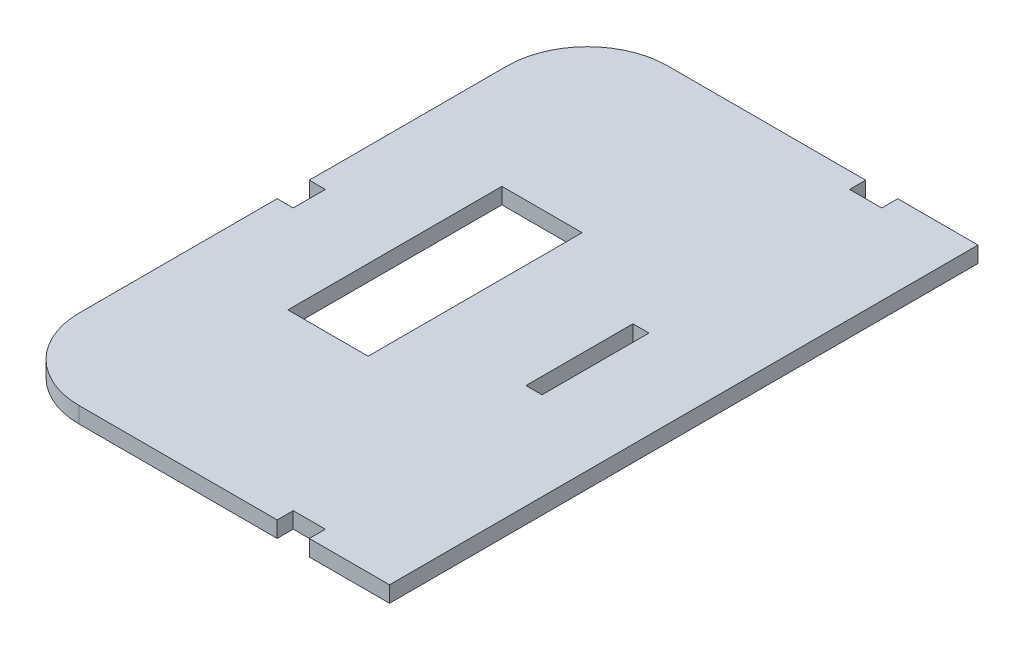
ISO-10303-21;
HEADER;
FILE_DESCRIPTION(('STEP AP214'),'2;1');
FILE_NAME('part.step','',(''),(''),'','','');
FILE_SCHEMA(('AUTOMOTIVE_DESIGN { 1 0 10303 214 1 1 1 1 }'));
ENDSEC;
DATA;
#1=APPLICATION_CONTEXT('core data for automotive mechanical design processes');
#2=APPLICATION_PROTOCOL_DEFINITION('international standard','automotive_design',2000,#1);
#3=PRODUCT_CONTEXT('',#1,'mechanical');
#4=PRODUCT('Part','Part','',(#3));
#5=PRODUCT_RELATED_PRODUCT_CATEGORY('part','',(#4));
#6=PRODUCT_DEFINITION_FORMATION('','',#4);
#7=PRODUCT_DEFINITION_CONTEXT('part definition',#1,'design');
#8=PRODUCT_DEFINITION('design','',#6,#7);
#9=PRODUCT_DEFINITION_SHAPE('','',#8);
#10=(LENGTH_UNIT() NAMED_UNIT(*) SI_UNIT(.MILLI.,.METRE.));
#11=(NAMED_UNIT(*) PLANE_ANGLE_UNIT() SI_UNIT($,.RADIAN.));
#12=(NAMED_UNIT(*) SI_UNIT($,.STERADIAN.) SOLID_ANGLE_UNIT());
#13=UNCERTAINTY_MEASURE_WITH_UNIT(LENGTH_MEASURE(1.E-05),#10,'distance_accuracy_value','');
#14=(GEOMETRIC_REPRESENTATION_CONTEXT(3) GLOBAL_UNCERTAINTY_ASSIGNED_CONTEXT((#13)) GLOBAL_UNIT_ASSIGNED_CONTEXT((#10,
#11,#12)) REPRESENTATION_CONTEXT('',''));
#15=CARTESIAN_POINT('',(0.,0.,0.));
#16=DIRECTION('',(0.,0.,1.));
#17=DIRECTION('',(1.,0.,0.));
#18=AXIS2_PLACEMENT_3D('',#15,#16,#17);
#19=CARTESIAN_POINT('',(73.,3.,0.));
#20=DIRECTION('',(1.,0.,0.));
#21=DIRECTION('',(0.,0.,-1.));
#22=AXIS2_PLACEMENT_3D('',#19,#20,#21);
#23=PLANE('',#22);
#24=DIRECTION('',(0.,0.,1.));
#25=VECTOR('',#24,1.);
#26=CARTESIAN_POINT('',(73.,0.,0.));
#27=LINE('',#26,#25);
#28=CARTESIAN_POINT('',(73.,0.,-110.));
#29=VERTEX_POINT('',#28);
#30=CARTESIAN_POINT('',(73.,0.,0.));
#31=VERTEX_POINT('',#30);
#32=EDGE_CURVE('E247',#29,#31,#27,.T.);
#33=ORIENTED_EDGE('',*,*,#32,.F.);
#34=DIRECTION('',(0.,-1.,0.));
#35=VECTOR('',#34,1.);
#36=CARTESIAN_POINT('',(73.,3.,-110.));
#37=LINE('',#36,#35);
#38=CARTESIAN_POINT('',(73.,3.,-110.));
#39=VERTEX_POINT('',#38);
#40=EDGE_CURVE('E383',#39,#29,#37,.T.);
#41=ORIENTED_EDGE('',*,*,#40,.F.);
#42=DIRECTION('',(0.,0.,1.));
#43=VECTOR('',#42,1.);
#44=CARTESIAN_POINT('',(73.,3.,0.));
#45=LINE('',#44,#43);
#46=CARTESIAN_POINT('',(73.,3.,0.));
#47=VERTEX_POINT('',#46);
#48=EDGE_CURVE('E270',#39,#47,#45,.T.);
#49=ORIENTED_EDGE('',*,*,#48,.T.);
#50=DIRECTION('',(0.,-1.,0.));
#51=VECTOR('',#50,1.);
#52=CARTESIAN_POINT('',(73.,3.,0.));
#53=LINE('',#52,#51);
#54=EDGE_CURVE('E311',#47,#31,#53,.T.);
#55=ORIENTED_EDGE('',*,*,#54,.T.);
#56=EDGE_LOOP('',(#33,#41,#49,#55));
#57=FACE_BOUND('',#56,.T.);
#58=ADVANCED_FACE('F41',(#57),#23,.T.);
#59=CARTESIAN_POINT('',(0.,3.,-110.));
#60=DIRECTION('',(0.,0.,-1.));
#61=DIRECTION('',(-1.,0.,0.));
#62=AXIS2_PLACEMENT_3D('',#59,#60,#61);
#63=PLANE('',#62);
#64=DIRECTION('',(1.,0.,0.));
#65=VECTOR('',#64,1.);
#66=CARTESIAN_POINT('',(0.,0.,-110.));
#67=LINE('',#66,#65);
#68=CARTESIAN_POINT('',(58.,0.,-110.));
#69=VERTEX_POINT('',#68);
#70=EDGE_CURVE('E314',#69,#29,#67,.T.);
#71=ORIENTED_EDGE('',*,*,#70,.F.);
#72=DIRECTION('',(0.,-1.,0.));
#73=VECTOR('',#72,1.);
#74=CARTESIAN_POINT('',(58.,3.,-110.));
#75=LINE('',#74,#73);
#76=CARTESIAN_POINT('',(58.,3.,-110.));
#77=VERTEX_POINT('',#76);
#78=EDGE_CURVE('E381',#77,#69,#75,.T.);
#79=ORIENTED_EDGE('',*,*,#78,.F.);
#80=DIRECTION('',(1.,0.,0.));
#81=VECTOR('',#80,1.);
#82=CARTESIAN_POINT('',(0.,3.,-110.));
#83=LINE('',#82,#81);
#84=EDGE_CURVE('E273',#77,#39,#83,.T.);
#85=ORIENTED_EDGE('',*,*,#84,.T.);
#86=ORIENTED_EDGE('',*,*,#40,.T.);
#87=EDGE_LOOP('',(#71,#79,#85,#86));
#88=FACE_BOUND('',#87,.T.);
#89=ADVANCED_FACE('F477',(#88),#63,.T.);
#90=CARTESIAN_POINT('',(57.9999999999995,3.,2.68303897617744E-13));
#91=DIRECTION('',(-1.,0.,0.));
#92=DIRECTION('',(0.,0.,1.));
#93=AXIS2_PLACEMENT_3D('',#90,#91,#92);
#94=PLANE('',#93);
#95=DIRECTION('',(0.,0.,-1.));
#96=VECTOR('',#95,1.);
#97=CARTESIAN_POINT('',(57.9999999999995,0.,2.68303897617744E-13));
#98=LINE('',#97,#96);
#99=CARTESIAN_POINT('',(58.,0.,-107.));
#100=VERTEX_POINT('',#99);
#101=EDGE_CURVE('E317',#100,#69,#98,.T.);
#102=ORIENTED_EDGE('',*,*,#101,.F.);
#103=DIRECTION('',(0.,-1.,0.));
#104=VECTOR('',#103,1.);
#105=CARTESIAN_POINT('',(58.,3.,-107.));
#106=LINE('',#105,#104);
#107=CARTESIAN_POINT('',(58.,3.,-107.));
#108=VERTEX_POINT('',#107);
#109=EDGE_CURVE('E379',#108,#100,#106,.T.);
#110=ORIENTED_EDGE('',*,*,#109,.F.);
#111=DIRECTION('',(0.,0.,-1.));
#112=VECTOR('',#111,1.);
#113=CARTESIAN_POINT('',(57.9999999999995,3.,2.68303897617744E-13));
#114=LINE('',#113,#112);
#115=EDGE_CURVE('E277',#108,#77,#114,.T.);
#116=ORIENTED_EDGE('',*,*,#115,.T.);
#117=ORIENTED_EDGE('',*,*,#78,.T.);
#118=EDGE_LOOP('',(#102,#110,#116,#117));
#119=FACE_BOUND('',#118,.T.);
#120=ADVANCED_FACE('F481',(#119),#94,.T.);
#121=CARTESIAN_POINT('',(0.,3.,-107.));
#122=DIRECTION('',(0.,0.,1.));
#123=DIRECTION('',(1.,0.,0.));
#124=AXIS2_PLACEMENT_3D('',#121,#122,#123);
#125=PLANE('',#124);
#126=DIRECTION('',(-1.,0.,0.));
#127=VECTOR('',#126,1.);
#128=CARTESIAN_POINT('',(0.,0.,-107.));
#129=LINE('',#128,#127);
#130=CARTESIAN_POINT('',(52.,0.,-107.));
#131=VERTEX_POINT('',#130);
#132=EDGE_CURVE('E320',#100,#131,#129,.T.);
#133=ORIENTED_EDGE('',*,*,#132,.T.);
#134=DIRECTION('',(0.,-1.,0.));
#135=VECTOR('',#134,1.);
#136=CARTESIAN_POINT('',(52.,3.,-107.));
#137=LINE('',#136,#135);
#138=CARTESIAN_POINT('',(52.,3.,-107.));
#139=VERTEX_POINT('',#138);
#140=EDGE_CURVE('E376',#139,#131,#137,.T.);
#141=ORIENTED_EDGE('',*,*,#140,.F.);
#142=DIRECTION('',(-1.,0.,0.));
#143=VECTOR('',#142,1.);
#144=CARTESIAN_POINT('',(0.,3.,-107.));
#145=LINE('',#144,#143);
#146=EDGE_CURVE('E280',#108,#139,#145,.T.);
#147=ORIENTED_EDGE('',*,*,#146,.F.);
#148=ORIENTED_EDGE('',*,*,#109,.T.);
#149=EDGE_LOOP('',(#133,#141,#147,#148));
#150=FACE_BOUND('',#149,.T.);
#151=ADVANCED_FACE('F486',(#150),#125,.F.);
#152=CARTESIAN_POINT('',(51.9999999999995,3.,2.40548322002115E-13));
#153=DIRECTION('',(-1.,0.,0.));
#154=DIRECTION('',(0.,0.,1.));
#155=AXIS2_PLACEMENT_3D('',#152,#153,#154);
#156=PLANE('',#155);
#157=DIRECTION('',(0.,0.,-1.));
#158=VECTOR('',#157,1.);
#159=CARTESIAN_POINT('',(51.9999999999995,0.,2.40548322002115E-13));
#160=LINE('',#159,#158);
#161=CARTESIAN_POINT('',(52.,0.,-110.));
#162=VERTEX_POINT('',#161);
#163=EDGE_CURVE('E322',#131,#162,#160,.T.);
#164=ORIENTED_EDGE('',*,*,#163,.T.);
#165=DIRECTION('',(0.,-1.,0.));
#166=VECTOR('',#165,1.);
#167=CARTESIAN_POINT('',(52.,3.,-110.));
#168=LINE('',#167,#166);
#169=CARTESIAN_POINT('',(52.,3.,-110.));
#170=VERTEX_POINT('',#169);
#171=EDGE_CURVE('E373',#170,#162,#168,.T.);
#172=ORIENTED_EDGE('',*,*,#171,.F.);
#173=DIRECTION('',(0.,0.,-1.));
#174=VECTOR('',#173,1.);
#175=CARTESIAN_POINT('',(51.9999999999995,3.,2.40548322002115E-13));
#176=LINE('',#175,#174);
#177=EDGE_CURVE('E282',#139,#170,#176,.T.);
#178=ORIENTED_EDGE('',*,*,#177,.F.);
#179=ORIENTED_EDGE('',*,*,#140,.T.);
#180=EDGE_LOOP('',(#164,#172,#178,#179));
#181=FACE_BOUND('',#180,.T.);
#182=ADVANCED_FACE('F490',(#181),#156,.F.);
#183=CARTESIAN_POINT('',(0.,3.,-110.));
#184=DIRECTION('',(0.,0.,-1.));
#185=DIRECTION('',(-1.,0.,0.));
#186=AXIS2_PLACEMENT_3D('',#183,#184,#185);
#187=PLANE('',#186);
#188=DIRECTION('',(1.,0.,0.));
#189=VECTOR('',#188,1.);
#190=CARTESIAN_POINT('',(0.,0.,-110.));
#191=LINE('',#190,#189);
#192=CARTESIAN_POINT('',(15.,0.,-110.));
#193=VERTEX_POINT('',#192);
#194=EDGE_CURVE('E325',#193,#162,#191,.T.);
#195=ORIENTED_EDGE('',*,*,#194,.F.);
#196=DIRECTION('',(0.,-1.,0.));
#197=VECTOR('',#196,1.);
#198=CARTESIAN_POINT('',(15.,3.,-110.));
#199=LINE('',#198,#197);
#200=CARTESIAN_POINT('',(15.,3.,-110.));
#201=VERTEX_POINT('',#200);
#202=EDGE_CURVE('E11',#193,#201,#199,.F.);
#203=ORIENTED_EDGE('',*,*,#202,.T.);
#204=DIRECTION('',(1.,0.,0.));
#205=VECTOR('',#204,1.);
#206=CARTESIAN_POINT('',(0.,3.,-110.));
#207=LINE('',#206,#205);
#208=EDGE_CURVE('E285',#201,#170,#207,.T.);
#209=ORIENTED_EDGE('',*,*,#208,.T.);
#210=ORIENTED_EDGE('',*,*,#171,.T.);
#211=EDGE_LOOP('',(#195,#203,#209,#210));
#212=FACE_BOUND('',#211,.T.);
#213=ADVANCED_FACE('F492',(#212),#187,.T.);
#214=CARTESIAN_POINT('',(0.,3.,0.));
#215=DIRECTION('',(-1.,0.,0.));
#216=DIRECTION('',(0.,0.,1.));
#217=AXIS2_PLACEMENT_3D('',#214,#215,#216);
#218=PLANE('',#217);
#219=DIRECTION('',(0.,0.,-1.));
#220=VECTOR('',#219,1.);
#221=CARTESIAN_POINT('',(0.,3.,0.));
#222=LINE('',#221,#220);
#223=CARTESIAN_POINT('',(0.,3.,-58.));
#224=VERTEX_POINT('',#223);
#225=CARTESIAN_POINT('',(0.,3.,-95.));
#226=VERTEX_POINT('',#225);
#227=EDGE_CURVE('E287',#224,#226,#222,.T.);
#228=ORIENTED_EDGE('',*,*,#227,.T.);
#229=DIRECTION('',(0.,-1.,0.));
#230=VECTOR('',#229,1.);
#231=CARTESIAN_POINT('',(0.,3.,-95.));
#232=LINE('',#231,#230);
#233=CARTESIAN_POINT('',(0.,0.,-95.));
#234=VERTEX_POINT('',#233);
#235=EDGE_CURVE('E49',#226,#234,#232,.T.);
#236=ORIENTED_EDGE('',*,*,#235,.T.);
#237=DIRECTION('',(0.,0.,-1.));
#238=VECTOR('',#237,1.);
#239=CARTESIAN_POINT('',(0.,0.,0.));
#240=LINE('',#239,#238);
#241=CARTESIAN_POINT('',(0.,0.,-58.));
#242=VERTEX_POINT('',#241);
#243=EDGE_CURVE('E327',#242,#234,#240,.T.);
#244=ORIENTED_EDGE('',*,*,#243,.F.);
#245=DIRECTION('',(0.,-1.,0.));
#246=VECTOR('',#245,1.);
#247=CARTESIAN_POINT('',(0.,3.,-58.));
#248=LINE('',#247,#246);
#249=EDGE_CURVE('E371',#224,#242,#248,.T.);
#250=ORIENTED_EDGE('',*,*,#249,.F.);
#251=EDGE_LOOP('',(#228,#236,#244,#250));
#252=FACE_BOUND('',#251,.T.);
#253=ADVANCED_FACE('F421',(#252),#218,.T.);
#254=CARTESIAN_POINT('',(0.,3.,-58.));
#255=DIRECTION('',(0.,0.,1.));
#256=DIRECTION('',(1.,0.,0.));
#257=AXIS2_PLACEMENT_3D('',#254,#255,#256);
#258=PLANE('',#257);
#259=DIRECTION('',(-1.,0.,0.));
#260=VECTOR('',#259,1.);
#261=CARTESIAN_POINT('',(0.,0.,-58.));
#262=LINE('',#261,#260);
#263=CARTESIAN_POINT('',(3.,0.,-58.));
#264=VERTEX_POINT('',#263);
#265=EDGE_CURVE('E330',#264,#242,#262,.T.);
#266=ORIENTED_EDGE('',*,*,#265,.F.);
#267=DIRECTION('',(0.,-1.,0.));
#268=VECTOR('',#267,1.);
#269=CARTESIAN_POINT('',(3.,3.,-58.));
#270=LINE('',#269,#268);
#271=CARTESIAN_POINT('',(3.,3.,-58.));
#272=VERTEX_POINT('',#271);
#273=EDGE_CURVE('E369',#272,#264,#270,.T.);
#274=ORIENTED_EDGE('',*,*,#273,.F.);
#275=DIRECTION('',(-1.,0.,0.));
#276=VECTOR('',#275,1.);
#277=CARTESIAN_POINT('',(0.,3.,-58.));
#278=LINE('',#277,#276);
#279=EDGE_CURVE('E289',#272,#224,#278,.T.);
#280=ORIENTED_EDGE('',*,*,#279,.T.);
#281=ORIENTED_EDGE('',*,*,#249,.T.);
#282=EDGE_LOOP('',(#266,#274,#280,#281));
#283=FACE_BOUND('',#282,.T.);
#284=ADVANCED_FACE('F430',(#283),#258,.T.);
#285=CARTESIAN_POINT('',(3.,3.,0.));
#286=DIRECTION('',(1.,0.,0.));
#287=DIRECTION('',(0.,0.,-1.));
#288=AXIS2_PLACEMENT_3D('',#285,#286,#287);
#289=PLANE('',#288);
#290=DIRECTION('',(0.,0.,1.));
#291=VECTOR('',#290,1.);
#292=CARTESIAN_POINT('',(3.,0.,0.));
#293=LINE('',#292,#291);
#294=CARTESIAN_POINT('',(3.,0.,-52.));
#295=VERTEX_POINT('',#294);
#296=EDGE_CURVE('E333',#264,#295,#293,.T.);
#297=ORIENTED_EDGE('',*,*,#296,.T.);
#298=DIRECTION('',(0.,-1.,0.));
#299=VECTOR('',#298,1.);
#300=CARTESIAN_POINT('',(3.,3.,-52.));
#301=LINE('',#300,#299);
#302=CARTESIAN_POINT('',(3.,3.,-52.));
#303=VERTEX_POINT('',#302);
#304=EDGE_CURVE('E366',#303,#295,#301,.T.);
#305=ORIENTED_EDGE('',*,*,#304,.F.);
#306=DIRECTION('',(0.,0.,1.));
#307=VECTOR('',#306,1.);
#308=CARTESIAN_POINT('',(3.,3.,0.));
#309=LINE('',#308,#307);
#310=EDGE_CURVE('E292',#272,#303,#309,.T.);
#311=ORIENTED_EDGE('',*,*,#310,.F.);
#312=ORIENTED_EDGE('',*,*,#273,.T.);
#313=EDGE_LOOP('',(#297,#305,#311,#312));
#314=FACE_BOUND('',#313,.T.);
#315=ADVANCED_FACE('F438',(#314),#289,.F.);
#316=CARTESIAN_POINT('',(0.,3.,-52.));
#317=DIRECTION('',(0.,0.,1.));
#318=DIRECTION('',(1.,0.,0.));
#319=AXIS2_PLACEMENT_3D('',#316,#317,#318);
#320=PLANE('',#319);
#321=DIRECTION('',(-1.,0.,0.));
#322=VECTOR('',#321,1.);
#323=CARTESIAN_POINT('',(0.,0.,-52.));
#324=LINE('',#323,#322);
#325=CARTESIAN_POINT('',(0.,0.,-52.));
#326=VERTEX_POINT('',#325);
#327=EDGE_CURVE('E335',#295,#326,#324,.T.);
#328=ORIENTED_EDGE('',*,*,#327,.T.);
#329=DIRECTION('',(0.,-1.,0.));
#330=VECTOR('',#329,1.);
#331=CARTESIAN_POINT('',(0.,3.,-52.));
#332=LINE('',#331,#330);
#333=CARTESIAN_POINT('',(0.,3.,-52.));
#334=VERTEX_POINT('',#333);
#335=EDGE_CURVE('E363',#334,#326,#332,.T.);
#336=ORIENTED_EDGE('',*,*,#335,.F.);
#337=DIRECTION('',(-1.,0.,0.));
#338=VECTOR('',#337,1.);
#339=CARTESIAN_POINT('',(0.,3.,-52.));
#340=LINE('',#339,#338);
#341=EDGE_CURVE('E294',#303,#334,#340,.T.);
#342=ORIENTED_EDGE('',*,*,#341,.F.);
#343=ORIENTED_EDGE('',*,*,#304,.T.);
#344=EDGE_LOOP('',(#328,#336,#342,#343));
#345=FACE_BOUND('',#344,.T.);
#346=ADVANCED_FACE('F440',(#345),#320,.F.);
#347=CARTESIAN_POINT('',(0.,3.,0.));
#348=DIRECTION('',(-1.,0.,0.));
#349=DIRECTION('',(0.,0.,1.));
#350=AXIS2_PLACEMENT_3D('',#347,#348,#349);
#351=PLANE('',#350);
#352=DIRECTION('',(0.,0.,-1.));
#353=VECTOR('',#352,1.);
#354=CARTESIAN_POINT('',(0.,0.,0.));
#355=LINE('',#354,#353);
#356=CARTESIAN_POINT('',(0.,0.,-15.));
#357=VERTEX_POINT('',#356);
#358=EDGE_CURVE('E338',#357,#326,#355,.T.);
#359=ORIENTED_EDGE('',*,*,#358,.F.);
#360=DIRECTION('',(0.,-1.,0.));
#361=VECTOR('',#360,1.);
#362=CARTESIAN_POINT('',(0.,3.,-15.));
#363=LINE('',#362,#361);
#364=CARTESIAN_POINT('',(0.,3.,-15.));
#365=VERTEX_POINT('',#364);
#366=EDGE_CURVE('E413',#357,#365,#363,.F.);
#367=ORIENTED_EDGE('',*,*,#366,.T.);
#368=DIRECTION('',(0.,0.,-1.));
#369=VECTOR('',#368,1.);
#370=CARTESIAN_POINT('',(0.,3.,0.));
#371=LINE('',#370,#369);
#372=EDGE_CURVE('E297',#365,#334,#371,.T.);
#373=ORIENTED_EDGE('',*,*,#372,.T.);
#374=ORIENTED_EDGE('',*,*,#335,.T.);
#375=EDGE_LOOP('',(#359,#367,#373,#374));
#376=FACE_BOUND('',#375,.T.);
#377=ADVANCED_FACE('F443',(#376),#351,.T.);
#378=CARTESIAN_POINT('',(0.,3.,0.));
#379=DIRECTION('',(0.,0.,-1.));
#380=DIRECTION('',(-1.,0.,0.));
#381=AXIS2_PLACEMENT_3D('',#378,#379,#380);
#382=PLANE('',#381);
#383=DIRECTION('',(1.,0.,0.));
#384=VECTOR('',#383,1.);
#385=CARTESIAN_POINT('',(0.,3.,0.));
#386=LINE('',#385,#384);
#387=CARTESIAN_POINT('',(15.,3.,0.));
#388=VERTEX_POINT('',#387);
#389=CARTESIAN_POINT('',(52.,3.,0.));
#390=VERTEX_POINT('',#389);
#391=EDGE_CURVE('E299',#388,#390,#386,.T.);
#392=ORIENTED_EDGE('',*,*,#391,.F.);
#393=DIRECTION('',(0.,-1.,0.));
#394=VECTOR('',#393,1.);
#395=CARTESIAN_POINT('',(15.,0.,0.));
#396=LINE('',#395,#394);
#397=CARTESIAN_POINT('',(15.,0.,0.));
#398=VERTEX_POINT('',#397);
#399=EDGE_CURVE('E406',#388,#398,#396,.T.);
#400=ORIENTED_EDGE('',*,*,#399,.T.);
#401=DIRECTION('',(1.,0.,0.));
#402=VECTOR('',#401,1.);
#403=CARTESIAN_POINT('',(0.,0.,0.));
#404=LINE('',#403,#402);
#405=CARTESIAN_POINT('',(52.,0.,0.));
#406=VERTEX_POINT('',#405);
#407=EDGE_CURVE('E340',#398,#406,#404,.T.);
#408=ORIENTED_EDGE('',*,*,#407,.T.);
#409=DIRECTION('',(0.,-1.,0.));
#410=VECTOR('',#409,1.);
#411=CARTESIAN_POINT('',(52.,3.,0.));
#412=LINE('',#411,#410);
#413=EDGE_CURVE('E360',#390,#406,#412,.T.);
#414=ORIENTED_EDGE('',*,*,#413,.F.);
#415=EDGE_LOOP('',(#392,#400,#408,#414));
#416=FACE_BOUND('',#415,.T.);
#417=ADVANCED_FACE('F451',(#416),#382,.F.);
#418=CARTESIAN_POINT('',(52.,3.,-2.40548322002117E-13));
#419=DIRECTION('',(1.,0.,0.));
#420=DIRECTION('',(0.,0.,-1.));
#421=AXIS2_PLACEMENT_3D('',#418,#419,#420);
#422=PLANE('',#421);
#423=DIRECTION('',(0.,0.,1.));
#424=VECTOR('',#423,1.);
#425=CARTESIAN_POINT('',(52.,0.,-2.40548322002117E-13));
#426=LINE('',#425,#424);
#427=CARTESIAN_POINT('',(52.,0.,-3.));
#428=VERTEX_POINT('',#427);
#429=EDGE_CURVE('E342',#428,#406,#426,.T.);
#430=ORIENTED_EDGE('',*,*,#429,.F.);
#431=DIRECTION('',(0.,-1.,0.));
#432=VECTOR('',#431,1.);
#433=CARTESIAN_POINT('',(52.,3.,-3.));
#434=LINE('',#433,#432);
#435=CARTESIAN_POINT('',(52.,3.,-3.));
#436=VERTEX_POINT('',#435);
#437=EDGE_CURVE('E358',#436,#428,#434,.T.);
#438=ORIENTED_EDGE('',*,*,#437,.F.);
#439=DIRECTION('',(0.,0.,1.));
#440=VECTOR('',#439,1.);
#441=CARTESIAN_POINT('',(52.,3.,-2.40548322002117E-13));
#442=LINE('',#441,#440);
#443=EDGE_CURVE('E301',#436,#390,#442,.T.);
#444=ORIENTED_EDGE('',*,*,#443,.T.);
#445=ORIENTED_EDGE('',*,*,#413,.T.);
#446=EDGE_LOOP('',(#430,#438,#444,#445));
#447=FACE_BOUND('',#446,.T.);
#448=ADVANCED_FACE('F457',(#447),#422,.T.);
#449=CARTESIAN_POINT('',(0.,3.,-3.));
#450=DIRECTION('',(0.,0.,1.));
#451=DIRECTION('',(1.,0.,0.));
#452=AXIS2_PLACEMENT_3D('',#449,#450,#451);
#453=PLANE('',#452);
#454=DIRECTION('',(-1.,0.,0.));
#455=VECTOR('',#454,1.);
#456=CARTESIAN_POINT('',(0.,0.,-3.));
#457=LINE('',#456,#455);
#458=CARTESIAN_POINT('',(58.,0.,-3.));
#459=VERTEX_POINT('',#458);
#460=EDGE_CURVE('E345',#459,#428,#457,.T.);
#461=ORIENTED_EDGE('',*,*,#460,.F.);
#462=DIRECTION('',(0.,-1.,0.));
#463=VECTOR('',#462,1.);
#464=CARTESIAN_POINT('',(58.,3.,-3.));
#465=LINE('',#464,#463);
#466=CARTESIAN_POINT('',(58.,3.,-3.));
#467=VERTEX_POINT('',#466);
#468=EDGE_CURVE('E356',#467,#459,#465,.T.);
#469=ORIENTED_EDGE('',*,*,#468,.F.);
#470=DIRECTION('',(-1.,0.,0.));
#471=VECTOR('',#470,1.);
#472=CARTESIAN_POINT('',(0.,3.,-3.));
#473=LINE('',#472,#471);
#474=EDGE_CURVE('E304',#467,#436,#473,.T.);
#475=ORIENTED_EDGE('',*,*,#474,.T.);
#476=ORIENTED_EDGE('',*,*,#437,.T.);
#477=EDGE_LOOP('',(#461,#469,#475,#476));
#478=FACE_BOUND('',#477,.T.);
#479=ADVANCED_FACE('F461',(#478),#453,.T.);
#480=CARTESIAN_POINT('',(58.,3.,-2.68303897617746E-13));
#481=DIRECTION('',(1.,0.,0.));
#482=DIRECTION('',(0.,0.,-1.));
#483=AXIS2_PLACEMENT_3D('',#480,#481,#482);
#484=PLANE('',#483);
#485=DIRECTION('',(0.,0.,1.));
#486=VECTOR('',#485,1.);
#487=CARTESIAN_POINT('',(58.,0.,-2.68303897617746E-13));
#488=LINE('',#487,#486);
#489=CARTESIAN_POINT('',(58.,0.,0.));
#490=VERTEX_POINT('',#489);
#491=EDGE_CURVE('E348',#459,#490,#488,.T.);
#492=ORIENTED_EDGE('',*,*,#491,.T.);
#493=DIRECTION('',(0.,-1.,0.));
#494=VECTOR('',#493,1.);
#495=CARTESIAN_POINT('',(58.,3.,0.));
#496=LINE('',#495,#494);
#497=CARTESIAN_POINT('',(58.,3.,0.));
#498=VERTEX_POINT('',#497);
#499=EDGE_CURVE('E353',#498,#490,#496,.T.);
#500=ORIENTED_EDGE('',*,*,#499,.F.);
#501=DIRECTION('',(0.,0.,1.));
#502=VECTOR('',#501,1.);
#503=CARTESIAN_POINT('',(58.,3.,-2.68303897617746E-13));
#504=LINE('',#503,#502);
#505=EDGE_CURVE('E307',#467,#498,#504,.T.);
#506=ORIENTED_EDGE('',*,*,#505,.F.);
#507=ORIENTED_EDGE('',*,*,#468,.T.);
#508=EDGE_LOOP('',(#492,#500,#506,#507));
#509=FACE_BOUND('',#508,.T.);
#510=ADVANCED_FACE('F465',(#509),#484,.F.);
#511=CARTESIAN_POINT('',(0.,3.,0.));
#512=DIRECTION('',(0.,0.,-1.));
#513=DIRECTION('',(-1.,0.,0.));
#514=AXIS2_PLACEMENT_3D('',#511,#512,#513);
#515=PLANE('',#514);
#516=DIRECTION('',(1.,0.,0.));
#517=VECTOR('',#516,1.);
#518=CARTESIAN_POINT('',(0.,0.,0.));
#519=LINE('',#518,#517);
#520=EDGE_CURVE('E274',#490,#31,#519,.T.);
#521=ORIENTED_EDGE('',*,*,#520,.T.);
#522=ORIENTED_EDGE('',*,*,#54,.F.);
#523=DIRECTION('',(1.,0.,0.));
#524=VECTOR('',#523,1.);
#525=CARTESIAN_POINT('',(0.,3.,0.));
#526=LINE('',#525,#524);
#527=EDGE_CURVE('E309',#498,#47,#526,.T.);
#528=ORIENTED_EDGE('',*,*,#527,.F.);
#529=ORIENTED_EDGE('',*,*,#499,.T.);
#530=EDGE_LOOP('',(#521,#522,#528,#529));
#531=FACE_BOUND('',#530,.T.);
#532=ADVANCED_FACE('F471',(#531),#515,.F.);
#533=CARTESIAN_POINT('',(0.,3.,0.));
#534=DIRECTION('',(0.,1.,0.));
#535=DIRECTION('',(0.,0.,1.));
#536=AXIS2_PLACEMENT_3D('',#533,#534,#535);
#537=PLANE('',#536);
#538=DIRECTION('',(0.,0.,1.));
#539=VECTOR('',#538,1.);
#540=CARTESIAN_POINT('',(19.,3.,-75.));
#541=LINE('',#540,#539);
#542=CARTESIAN_POINT('',(19.,3.,-75.));
#543=VERTEX_POINT('',#542);
#544=CARTESIAN_POINT('',(19.,3.,-35.));
#545=VERTEX_POINT('',#544);
#546=EDGE_CURVE('E235',#543,#545,#541,.T.);
#547=ORIENTED_EDGE('',*,*,#546,.F.);
#548=DIRECTION('',(-1.,0.,0.));
#549=VECTOR('',#548,1.);
#550=CARTESIAN_POINT('',(19.,3.,-75.));
#551=LINE('',#550,#549);
#552=CARTESIAN_POINT('',(34.,3.,-75.0000000000001));
#553=VERTEX_POINT('',#552);
#554=EDGE_CURVE('E240',#553,#543,#551,.T.);
#555=ORIENTED_EDGE('',*,*,#554,.F.);
#556=DIRECTION('',(0.,0.,-1.));
#557=VECTOR('',#556,1.);
#558=CARTESIAN_POINT('',(34.,3.,-75.0000000000001));
#559=LINE('',#558,#557);
#560=CARTESIAN_POINT('',(34.,3.,-35.));
#561=VERTEX_POINT('',#560);
#562=EDGE_CURVE('E219',#561,#553,#559,.T.);
#563=ORIENTED_EDGE('',*,*,#562,.F.);
#564=DIRECTION('',(1.,0.,0.));
#565=VECTOR('',#564,1.);
#566=CARTESIAN_POINT('',(19.,3.,-35.));
#567=LINE('',#566,#565);
#568=EDGE_CURVE('E230',#545,#561,#567,.T.);
#569=ORIENTED_EDGE('',*,*,#568,.F.);
#570=EDGE_LOOP('',(#547,#555,#563,#569));
#571=FACE_BOUND('',#570,.T.);
#572=DIRECTION('',(0.,0.,1.));
#573=VECTOR('',#572,1.);
#574=CARTESIAN_POINT('',(53.5,3.,-65.));
#575=LINE('',#574,#573);
#576=CARTESIAN_POINT('',(53.5,3.,-65.));
#577=VERTEX_POINT('',#576);
#578=CARTESIAN_POINT('',(53.5,3.,-45.));
#579=VERTEX_POINT('',#578);
#580=EDGE_CURVE('E268',#577,#579,#575,.T.);
#581=ORIENTED_EDGE('',*,*,#580,.F.);
#582=DIRECTION('',(-1.,0.,0.));
#583=VECTOR('',#582,1.);
#584=CARTESIAN_POINT('',(53.5,3.,-65.));
#585=LINE('',#584,#583);
#586=CARTESIAN_POINT('',(56.5,3.,-65.));
#587=VERTEX_POINT('',#586);
#588=EDGE_CURVE('E253',#587,#577,#585,.T.);
#589=ORIENTED_EDGE('',*,*,#588,.F.);
#590=DIRECTION('',(0.,0.,-1.));
#591=VECTOR('',#590,1.);
#592=CARTESIAN_POINT('',(56.5,3.,-65.));
#593=LINE('',#592,#591);
#594=CARTESIAN_POINT('',(56.5,3.,-45.));
#595=VERTEX_POINT('',#594);
#596=EDGE_CURVE('E262',#595,#587,#593,.T.);
#597=ORIENTED_EDGE('',*,*,#596,.F.);
#598=DIRECTION('',(1.,0.,0.));
#599=VECTOR('',#598,1.);
#600=CARTESIAN_POINT('',(53.5,3.,-45.));
#601=LINE('',#600,#599);
#602=EDGE_CURVE('E265',#579,#595,#601,.T.);
#603=ORIENTED_EDGE('',*,*,#602,.F.);
#604=EDGE_LOOP('',(#581,#589,#597,#603));
#605=FACE_BOUND('',#604,.T.);
#606=ORIENTED_EDGE('',*,*,#372,.F.);
#607=CARTESIAN_POINT('',(15.,3.,-15.));
#608=DIRECTION('',(0.,1.,0.));
#609=DIRECTION('',(0.,0.,1.));
#610=AXIS2_PLACEMENT_3D('',#607,#608,#609);
#611=CIRCLE('',#610,15.);
#612=EDGE_CURVE('E416',#365,#388,#611,.T.);
#613=ORIENTED_EDGE('',*,*,#612,.T.);
#614=ORIENTED_EDGE('',*,*,#391,.T.);
#615=ORIENTED_EDGE('',*,*,#443,.F.);
#616=ORIENTED_EDGE('',*,*,#474,.F.);
#617=ORIENTED_EDGE('',*,*,#505,.T.);
#618=ORIENTED_EDGE('',*,*,#527,.T.);
#619=ORIENTED_EDGE('',*,*,#48,.F.);
#620=ORIENTED_EDGE('',*,*,#84,.F.);
#621=ORIENTED_EDGE('',*,*,#115,.F.);
#622=ORIENTED_EDGE('',*,*,#146,.T.);
#623=ORIENTED_EDGE('',*,*,#177,.T.);
#624=ORIENTED_EDGE('',*,*,#208,.F.);
#625=CARTESIAN_POINT('',(15.,3.,-95.));
#626=DIRECTION('',(0.,1.,0.));
#627=DIRECTION('',(0.,0.,1.));
#628=AXIS2_PLACEMENT_3D('',#625,#626,#627);
#629=CIRCLE('',#628,15.);
#630=EDGE_CURVE('E56',#201,#226,#629,.T.);
#631=ORIENTED_EDGE('',*,*,#630,.T.);
#632=ORIENTED_EDGE('',*,*,#227,.F.);
#633=ORIENTED_EDGE('',*,*,#279,.F.);
#634=ORIENTED_EDGE('',*,*,#310,.T.);
#635=ORIENTED_EDGE('',*,*,#341,.T.);
#636=EDGE_LOOP('',(#606,#613,#614,#615,#616,#617,#618,#619,#620,#621,#622,#623,#624,#631,#632,
#633,#634,#635));
#637=FACE_BOUND('',#636,.T.);
#638=ADVANCED_FACE('F237',(#571,#605,#637),#537,.T.);
#639=CARTESIAN_POINT('',(0.,0.,0.));
#640=DIRECTION('',(0.,1.,0.));
#641=DIRECTION('',(0.,0.,1.));
#642=AXIS2_PLACEMENT_3D('',#639,#640,#641);
#643=PLANE('',#642);
#644=DIRECTION('',(-1.,0.,0.));
#645=VECTOR('',#644,1.);
#646=CARTESIAN_POINT('',(0.,0.,-75.));
#647=LINE('',#646,#645);
#648=CARTESIAN_POINT('',(34.,0.,-75.0000000000001));
#649=VERTEX_POINT('',#648);
#650=CARTESIAN_POINT('',(19.,0.,-75.));
#651=VERTEX_POINT('',#650);
#652=EDGE_CURVE('E400',#649,#651,#647,.T.);
#653=ORIENTED_EDGE('',*,*,#652,.T.);
#654=DIRECTION('',(0.,0.,1.));
#655=VECTOR('',#654,1.);
#656=CARTESIAN_POINT('',(19.,0.,0.));
#657=LINE('',#656,#655);
#658=CARTESIAN_POINT('',(19.,0.,-35.));
#659=VERTEX_POINT('',#658);
#660=EDGE_CURVE('E403',#651,#659,#657,.T.);
#661=ORIENTED_EDGE('',*,*,#660,.T.);
#662=DIRECTION('',(1.,0.,0.));
#663=VECTOR('',#662,1.);
#664=CARTESIAN_POINT('',(0.,0.,-35.));
#665=LINE('',#664,#663);
#666=CARTESIAN_POINT('',(34.,0.,-35.));
#667=VERTEX_POINT('',#666);
#668=EDGE_CURVE('E397',#659,#667,#665,.T.);
#669=ORIENTED_EDGE('',*,*,#668,.T.);
#670=DIRECTION('',(0.,0.,-1.));
#671=VECTOR('',#670,1.);
#672=CARTESIAN_POINT('',(34.,0.,0.));
#673=LINE('',#672,#671);
#674=EDGE_CURVE('E222',#667,#649,#673,.T.);
#675=ORIENTED_EDGE('',*,*,#674,.T.);
#676=EDGE_LOOP('',(#653,#661,#669,#675));
#677=FACE_BOUND('',#676,.T.);
#678=DIRECTION('',(-1.,0.,0.));
#679=VECTOR('',#678,1.);
#680=CARTESIAN_POINT('',(0.,0.,-65.));
#681=LINE('',#680,#679);
#682=CARTESIAN_POINT('',(56.5,0.,-65.));
#683=VERTEX_POINT('',#682);
#684=CARTESIAN_POINT('',(53.5,0.,-65.));
#685=VERTEX_POINT('',#684);
#686=EDGE_CURVE('E391',#683,#685,#681,.T.);
#687=ORIENTED_EDGE('',*,*,#686,.T.);
#688=DIRECTION('',(0.,0.,1.));
#689=VECTOR('',#688,1.);
#690=CARTESIAN_POINT('',(53.5,0.,0.));
#691=LINE('',#690,#689);
#692=CARTESIAN_POINT('',(53.5,0.,-45.));
#693=VERTEX_POINT('',#692);
#694=EDGE_CURVE('E394',#685,#693,#691,.T.);
#695=ORIENTED_EDGE('',*,*,#694,.T.);
#696=DIRECTION('',(1.,0.,0.));
#697=VECTOR('',#696,1.);
#698=CARTESIAN_POINT('',(0.,0.,-45.));
#699=LINE('',#698,#697);
#700=CARTESIAN_POINT('',(56.5,0.,-45.));
#701=VERTEX_POINT('',#700);
#702=EDGE_CURVE('E385',#693,#701,#699,.T.);
#703=ORIENTED_EDGE('',*,*,#702,.T.);
#704=DIRECTION('',(0.,0.,-1.));
#705=VECTOR('',#704,1.);
#706=CARTESIAN_POINT('',(56.5,0.,0.));
#707=LINE('',#706,#705);
#708=EDGE_CURVE('E388',#701,#683,#707,.T.);
#709=ORIENTED_EDGE('',*,*,#708,.T.);
#710=EDGE_LOOP('',(#687,#695,#703,#709));
#711=FACE_BOUND('',#710,.T.);
#712=ORIENTED_EDGE('',*,*,#407,.F.);
#713=CARTESIAN_POINT('',(15.,0.,-15.));
#714=DIRECTION('',(0.,1.,0.));
#715=DIRECTION('',(0.,0.,1.));
#716=AXIS2_PLACEMENT_3D('',#713,#714,#715);
#717=CIRCLE('',#716,15.);
#718=EDGE_CURVE('E411',#398,#357,#717,.F.);
#719=ORIENTED_EDGE('',*,*,#718,.T.);
#720=ORIENTED_EDGE('',*,*,#358,.T.);
#721=ORIENTED_EDGE('',*,*,#327,.F.);
#722=ORIENTED_EDGE('',*,*,#296,.F.);
#723=ORIENTED_EDGE('',*,*,#265,.T.);
#724=ORIENTED_EDGE('',*,*,#243,.T.);
#725=CARTESIAN_POINT('',(15.,0.,-95.));
#726=DIRECTION('',(0.,1.,0.));
#727=DIRECTION('',(0.,0.,1.));
#728=AXIS2_PLACEMENT_3D('',#725,#726,#727);
#729=CIRCLE('',#728,15.);
#730=EDGE_CURVE('E409',#234,#193,#729,.F.);
#731=ORIENTED_EDGE('',*,*,#730,.T.);
#732=ORIENTED_EDGE('',*,*,#194,.T.);
#733=ORIENTED_EDGE('',*,*,#163,.F.);
#734=ORIENTED_EDGE('',*,*,#132,.F.);
#735=ORIENTED_EDGE('',*,*,#101,.T.);
#736=ORIENTED_EDGE('',*,*,#70,.T.);
#737=ORIENTED_EDGE('',*,*,#32,.T.);
#738=ORIENTED_EDGE('',*,*,#520,.F.);
#739=ORIENTED_EDGE('',*,*,#491,.F.);
#740=ORIENTED_EDGE('',*,*,#460,.T.);
#741=ORIENTED_EDGE('',*,*,#429,.T.);
#742=EDGE_LOOP('',(#712,#719,#720,#721,#722,#723,#724,#731,#732,#733,#734,#735,#736,#737,#738,
#739,#740,#741));
#743=FACE_BOUND('',#742,.T.);
#744=ADVANCED_FACE('F425',(#677,#711,#743),#643,.F.);
#745=CARTESIAN_POINT('',(53.5,-7.,-65.));
#746=DIRECTION('',(-1.,0.,0.));
#747=DIRECTION('',(0.,0.,1.));
#748=AXIS2_PLACEMENT_3D('',#745,#746,#747);
#749=PLANE('',#748);
#750=DIRECTION('',(0.,1.,0.));
#751=VECTOR('',#750,1.);
#752=CARTESIAN_POINT('',(53.5,-7.,-65.));
#753=LINE('',#752,#751);
#754=EDGE_CURVE('E258',#685,#577,#753,.T.);
#755=ORIENTED_EDGE('',*,*,#754,.T.);
#756=ORIENTED_EDGE('',*,*,#580,.T.);
#757=DIRECTION('',(0.,1.,0.));
#758=VECTOR('',#757,1.);
#759=CARTESIAN_POINT('',(53.5,-7.,-45.));
#760=LINE('',#759,#758);
#761=EDGE_CURVE('E250',#693,#579,#760,.T.);
#762=ORIENTED_EDGE('',*,*,#761,.F.);
#763=ORIENTED_EDGE('',*,*,#694,.F.);
#764=EDGE_LOOP('',(#755,#756,#762,#763));
#765=FACE_BOUND('',#764,.T.);
#766=ADVANCED_FACE('F534',(#765),#749,.F.);
#767=CARTESIAN_POINT('',(53.5,-7.,-65.));
#768=DIRECTION('',(0.,0.,-1.));
#769=DIRECTION('',(-1.,0.,0.));
#770=AXIS2_PLACEMENT_3D('',#767,#768,#769);
#771=PLANE('',#770);
#772=DIRECTION('',(0.,1.,0.));
#773=VECTOR('',#772,1.);
#774=CARTESIAN_POINT('',(56.5,-7.,-65.));
#775=LINE('',#774,#773);
#776=EDGE_CURVE('E256',#683,#587,#775,.T.);
#777=ORIENTED_EDGE('',*,*,#776,.T.);
#778=ORIENTED_EDGE('',*,*,#588,.T.);
#779=ORIENTED_EDGE('',*,*,#754,.F.);
#780=ORIENTED_EDGE('',*,*,#686,.F.);
#781=EDGE_LOOP('',(#777,#778,#779,#780));
#782=FACE_BOUND('',#781,.T.);
#783=ADVANCED_FACE('F538',(#782),#771,.F.);
#784=CARTESIAN_POINT('',(56.5,-7.,-65.));
#785=DIRECTION('',(1.,0.,0.));
#786=DIRECTION('',(0.,0.,-1.));
#787=AXIS2_PLACEMENT_3D('',#784,#785,#786);
#788=PLANE('',#787);
#789=DIRECTION('',(0.,1.,0.));
#790=VECTOR('',#789,1.);
#791=CARTESIAN_POINT('',(56.5,-7.,-45.));
#792=LINE('',#791,#790);
#793=EDGE_CURVE('E254',#701,#595,#792,.T.);
#794=ORIENTED_EDGE('',*,*,#793,.T.);
#795=ORIENTED_EDGE('',*,*,#596,.T.);
#796=ORIENTED_EDGE('',*,*,#776,.F.);
#797=ORIENTED_EDGE('',*,*,#708,.F.);
#798=EDGE_LOOP('',(#794,#795,#796,#797));
#799=FACE_BOUND('',#798,.T.);
#800=ADVANCED_FACE('F541',(#799),#788,.F.);
#801=CARTESIAN_POINT('',(53.5,-7.,-45.));
#802=DIRECTION('',(0.,0.,1.));
#803=DIRECTION('',(1.,0.,0.));
#804=AXIS2_PLACEMENT_3D('',#801,#802,#803);
#805=PLANE('',#804);
#806=ORIENTED_EDGE('',*,*,#761,.T.);
#807=ORIENTED_EDGE('',*,*,#602,.T.);
#808=ORIENTED_EDGE('',*,*,#793,.F.);
#809=ORIENTED_EDGE('',*,*,#702,.F.);
#810=EDGE_LOOP('',(#806,#807,#808,#809));
#811=FACE_BOUND('',#810,.T.);
#812=ADVANCED_FACE('F545',(#811),#805,.F.);
#813=CARTESIAN_POINT('',(19.,-7.,-75.));
#814=DIRECTION('',(-1.,0.,0.));
#815=DIRECTION('',(0.,0.,1.));
#816=AXIS2_PLACEMENT_3D('',#813,#814,#815);
#817=PLANE('',#816);
#818=DIRECTION('',(0.,1.,0.));
#819=VECTOR('',#818,1.);
#820=CARTESIAN_POINT('',(19.,-7.,-75.));
#821=LINE('',#820,#819);
#822=EDGE_CURVE('E245',#651,#543,#821,.T.);
#823=ORIENTED_EDGE('',*,*,#822,.T.);
#824=ORIENTED_EDGE('',*,*,#546,.T.);
#825=DIRECTION('',(0.,1.,0.));
#826=VECTOR('',#825,1.);
#827=CARTESIAN_POINT('',(19.,-7.,-35.));
#828=LINE('',#827,#826);
#829=EDGE_CURVE('E226',#659,#545,#828,.T.);
#830=ORIENTED_EDGE('',*,*,#829,.F.);
#831=ORIENTED_EDGE('',*,*,#660,.F.);
#832=EDGE_LOOP('',(#823,#824,#830,#831));
#833=FACE_BOUND('',#832,.T.);
#834=ADVANCED_FACE('F549',(#833),#817,.F.);
#835=CARTESIAN_POINT('',(19.,-7.,-75.));
#836=DIRECTION('',(0.,0.,-1.));
#837=DIRECTION('',(-1.,0.,0.));
#838=AXIS2_PLACEMENT_3D('',#835,#836,#837);
#839=PLANE('',#838);
#840=DIRECTION('',(0.,1.,0.));
#841=VECTOR('',#840,1.);
#842=CARTESIAN_POINT('',(34.,-7.,-75.0000000000001));
#843=LINE('',#842,#841);
#844=EDGE_CURVE('E225',#649,#553,#843,.T.);
#845=ORIENTED_EDGE('',*,*,#844,.T.);
#846=ORIENTED_EDGE('',*,*,#554,.T.);
#847=ORIENTED_EDGE('',*,*,#822,.F.);
#848=ORIENTED_EDGE('',*,*,#652,.F.);
#849=EDGE_LOOP('',(#845,#846,#847,#848));
#850=FACE_BOUND('',#849,.T.);
#851=ADVANCED_FACE('F556',(#850),#839,.F.);
#852=CARTESIAN_POINT('',(34.,-7.,-75.0000000000001));
#853=DIRECTION('',(1.,0.,0.));
#854=DIRECTION('',(0.,0.,-1.));
#855=AXIS2_PLACEMENT_3D('',#852,#853,#854);
#856=PLANE('',#855);
#857=DIRECTION('',(0.,1.,0.));
#858=VECTOR('',#857,1.);
#859=CARTESIAN_POINT('',(34.,-7.,-35.));
#860=LINE('',#859,#858);
#861=EDGE_CURVE('E214',#667,#561,#860,.T.);
#862=ORIENTED_EDGE('',*,*,#861,.T.);
#863=ORIENTED_EDGE('',*,*,#562,.T.);
#864=ORIENTED_EDGE('',*,*,#844,.F.);
#865=ORIENTED_EDGE('',*,*,#674,.F.);
#866=EDGE_LOOP('',(#862,#863,#864,#865));
#867=FACE_BOUND('',#866,.T.);
#868=ADVANCED_FACE('F216',(#867),#856,.F.);
#869=CARTESIAN_POINT('',(19.,-7.,-35.));
#870=DIRECTION('',(0.,0.,1.));
#871=DIRECTION('',(1.,0.,0.));
#872=AXIS2_PLACEMENT_3D('',#869,#870,#871);
#873=PLANE('',#872);
#874=ORIENTED_EDGE('',*,*,#829,.T.);
#875=ORIENTED_EDGE('',*,*,#568,.T.);
#876=ORIENTED_EDGE('',*,*,#861,.F.);
#877=ORIENTED_EDGE('',*,*,#668,.F.);
#878=EDGE_LOOP('',(#874,#875,#876,#877));
#879=FACE_BOUND('',#878,.T.);
#880=ADVANCED_FACE('F231',(#879),#873,.F.);
#881=CARTESIAN_POINT('',(15.,3.,-15.));
#882=DIRECTION('',(0.,1.,0.));
#883=DIRECTION('',(0.,0.,1.));
#884=AXIS2_PLACEMENT_3D('',#881,#882,#883);
#885=CYLINDRICAL_SURFACE('',#884,15.);
#886=ORIENTED_EDGE('',*,*,#612,.F.);
#887=ORIENTED_EDGE('',*,*,#366,.F.);
#888=ORIENTED_EDGE('',*,*,#718,.F.);
#889=ORIENTED_EDGE('',*,*,#399,.F.);
#890=EDGE_LOOP('',(#886,#887,#888,#889));
#891=FACE_BOUND('',#890,.T.);
#892=ADVANCED_FACE('F449',(#891),#885,.T.);
#893=CARTESIAN_POINT('',(15.,3.,-95.));
#894=DIRECTION('',(0.,-1.,0.));
#895=DIRECTION('',(0.,0.,-1.));
#896=AXIS2_PLACEMENT_3D('',#893,#894,#895);
#897=CYLINDRICAL_SURFACE('',#896,15.);
#898=ORIENTED_EDGE('',*,*,#630,.F.);
#899=ORIENTED_EDGE('',*,*,#202,.F.);
#900=ORIENTED_EDGE('',*,*,#730,.F.);
#901=ORIENTED_EDGE('',*,*,#235,.F.);
#902=EDGE_LOOP('',(#898,#899,#900,#901));
#903=FACE_BOUND('',#902,.T.);
#904=ADVANCED_FACE('F43',(#903),#897,.T.);
#905=CLOSED_SHELL('',(#58,#89,#120,#151,#182,#213,#253,#284,#315,#346,#377,#417,#448,#479,#510,
#532,#638,#744,#766,#783,#800,#812,#834,#851,#868,#880,#892,#904));
#906=MANIFOLD_SOLID_BREP('B2',#905);
#907=ADVANCED_BREP_SHAPE_REPRESENTATION('',(#18,#906),#14);
#908=SHAPE_DEFINITION_REPRESENTATION(#9,#907);
ENDSEC;
END-ISO-10303-21;
